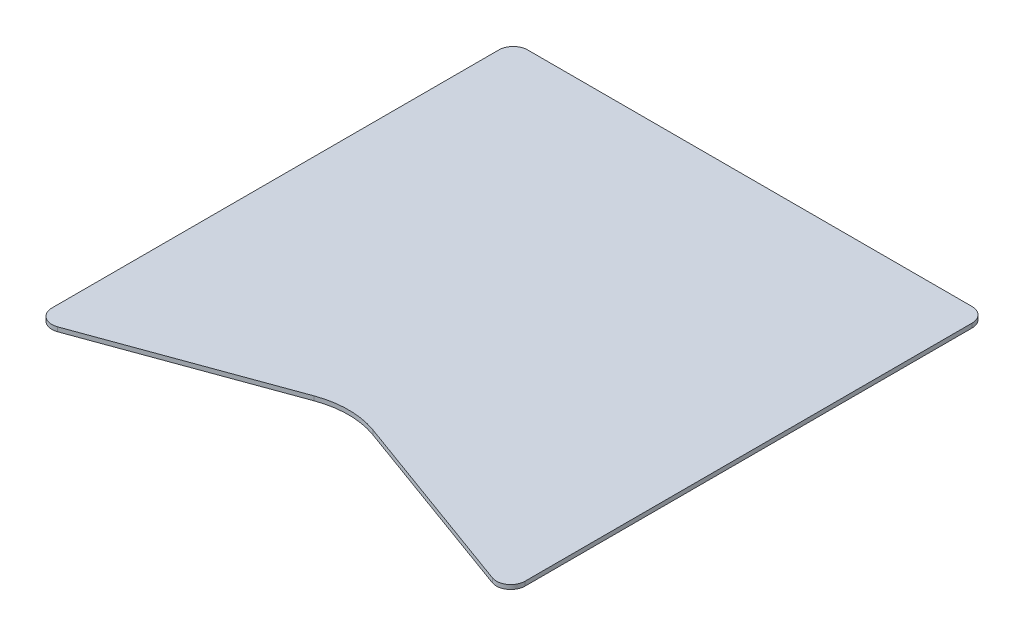
ISO-10303-21;
HEADER;
FILE_DESCRIPTION(('STEP AP214'),'2;1');
FILE_NAME('part.step','',(''),(''),'','','');
FILE_SCHEMA(('AUTOMOTIVE_DESIGN { 1 0 10303 214 1 1 1 1 }'));
ENDSEC;
DATA;
#1=APPLICATION_CONTEXT('core data for automotive mechanical design processes');
#2=APPLICATION_PROTOCOL_DEFINITION('international standard','automotive_design',2000,#1);
#3=PRODUCT_CONTEXT('',#1,'mechanical');
#4=PRODUCT('Part','Part','',(#3));
#5=PRODUCT_RELATED_PRODUCT_CATEGORY('part','',(#4));
#6=PRODUCT_DEFINITION_FORMATION('','',#4);
#7=PRODUCT_DEFINITION_CONTEXT('part definition',#1,'design');
#8=PRODUCT_DEFINITION('design','',#6,#7);
#9=PRODUCT_DEFINITION_SHAPE('','',#8);
#10=(LENGTH_UNIT() NAMED_UNIT(*) SI_UNIT(.MILLI.,.METRE.));
#11=(NAMED_UNIT(*) PLANE_ANGLE_UNIT() SI_UNIT($,.RADIAN.));
#12=(NAMED_UNIT(*) SI_UNIT($,.STERADIAN.) SOLID_ANGLE_UNIT());
#13=UNCERTAINTY_MEASURE_WITH_UNIT(LENGTH_MEASURE(1.E-05),#10,'distance_accuracy_value','');
#14=(GEOMETRIC_REPRESENTATION_CONTEXT(3) GLOBAL_UNCERTAINTY_ASSIGNED_CONTEXT((#13)) GLOBAL_UNIT_ASSIGNED_CONTEXT((#10,
#11,#12)) REPRESENTATION_CONTEXT('',''));
#15=CARTESIAN_POINT('',(0.,0.,0.));
#16=DIRECTION('',(0.,0.,1.));
#17=DIRECTION('',(1.,0.,0.));
#18=AXIS2_PLACEMENT_3D('',#15,#16,#17);
#19=CARTESIAN_POINT('',(24.4316355925699,3.,67.1253671109287));
#20=DIRECTION('',(-0.342020143325673,0.,-0.939692620785907));
#21=DIRECTION('',(-0.939692620785907,0.,0.342020143325673));
#22=AXIS2_PLACEMENT_3D('',#19,#20,#21);
#23=PLANE('',#22);
#24=DIRECTION('',(0.939692620785907,0.,-0.342020143325673));
#25=VECTOR('',#24,1.);
#26=CARTESIAN_POINT('',(24.4316355925699,3.,67.1253671109287));
#27=LINE('',#26,#25);
#28=CARTESIAN_POINT('',(13.4202014332567,3.,71.1332013815009));
#29=VERTEX_POINT('',#28);
#30=CARTESIAN_POINT('',(144.47879140046,3.,23.4317756885392));
#31=VERTEX_POINT('',#30);
#32=EDGE_CURVE('E162',#29,#31,#27,.T.);
#33=ORIENTED_EDGE('',*,*,#32,.F.);
#34=DIRECTION('',(0.,-1.,0.));
#35=VECTOR('',#34,1.);
#36=CARTESIAN_POINT('',(13.4202014332567,0.,71.1332013815009));
#37=LINE('',#36,#35);
#38=CARTESIAN_POINT('',(13.4202014332567,0.,71.1332013815009));
#39=VERTEX_POINT('',#38);
#40=EDGE_CURVE('E12',#29,#39,#37,.T.);
#41=ORIENTED_EDGE('',*,*,#40,.T.);
#42=DIRECTION('',(0.939692620785907,0.,-0.342020143325673));
#43=VECTOR('',#42,1.);
#44=CARTESIAN_POINT('',(24.4316355925699,0.,67.1253671109287));
#45=LINE('',#44,#43);
#46=CARTESIAN_POINT('',(144.47879140046,0.,23.4317756885392));
#47=VERTEX_POINT('',#46);
#48=EDGE_CURVE('E179',#39,#47,#45,.T.);
#49=ORIENTED_EDGE('',*,*,#48,.T.);
#50=DIRECTION('',(0.,-1.,0.));
#51=VECTOR('',#50,1.);
#52=CARTESIAN_POINT('',(144.47879140046,3.,23.4317756885392));
#53=LINE('',#52,#51);
#54=EDGE_CURVE('E177',#31,#47,#53,.T.);
#55=ORIENTED_EDGE('',*,*,#54,.F.);
#56=EDGE_LOOP('',(#33,#41,#49,#55));
#57=FACE_BOUND('',#56,.T.);
#58=ADVANCED_FACE('F82',(#57),#23,.F.);
#59=CARTESIAN_POINT('',(165.,3.,79.8133329356935));
#60=DIRECTION('',(0.,-1.,0.));
#61=DIRECTION('',(0.,0.,-1.));
#62=AXIS2_PLACEMENT_3D('',#59,#60,#61);
#63=CYLINDRICAL_SURFACE('',#62,60.);
#64=CARTESIAN_POINT('',(165.,0.,79.8133329356935));
#65=DIRECTION('',(0.,1.,0.));
#66=DIRECTION('',(0.,0.,1.));
#67=AXIS2_PLACEMENT_3D('',#64,#65,#66);
#68=CIRCLE('',#67,60.);
#69=CARTESIAN_POINT('',(185.52120859954,0.,23.4317756885392));
#70=VERTEX_POINT('',#69);
#71=EDGE_CURVE('E205',#70,#47,#68,.T.);
#72=ORIENTED_EDGE('',*,*,#71,.F.);
#73=DIRECTION('',(0.,-1.,0.));
#74=VECTOR('',#73,1.);
#75=CARTESIAN_POINT('',(185.52120859954,3.,23.4317756885392));
#76=LINE('',#75,#74);
#77=CARTESIAN_POINT('',(185.52120859954,3.,23.4317756885392));
#78=VERTEX_POINT('',#77);
#79=EDGE_CURVE('E185',#78,#70,#76,.T.);
#80=ORIENTED_EDGE('',*,*,#79,.F.);
#81=CARTESIAN_POINT('',(165.,3.,79.8133329356935));
#82=DIRECTION('',(0.,1.,0.));
#83=DIRECTION('',(0.,0.,1.));
#84=AXIS2_PLACEMENT_3D('',#81,#82,#83);
#85=CIRCLE('',#84,60.);
#86=EDGE_CURVE('E168',#78,#31,#85,.T.);
#87=ORIENTED_EDGE('',*,*,#86,.T.);
#88=ORIENTED_EDGE('',*,*,#54,.T.);
#89=EDGE_LOOP('',(#72,#80,#87,#88));
#90=FACE_BOUND('',#89,.T.);
#91=ADVANCED_FACE('F187',(#90),#63,.F.);
#92=CARTESIAN_POINT('',(14.1710312927996,3.,-38.9345884873514));
#93=DIRECTION('',(0.342020143325673,0.,-0.939692620785907));
#94=DIRECTION('',(-0.939692620785907,0.,-0.342020143325673));
#95=AXIS2_PLACEMENT_3D('',#92,#93,#94);
#96=PLANE('',#95);
#97=DIRECTION('',(0.939692620785907,0.,0.342020143325673));
#98=VECTOR('',#97,1.);
#99=CARTESIAN_POINT('',(14.1710312927996,0.,-38.9345884873514));
#100=LINE('',#99,#98);
#101=CARTESIAN_POINT('',(316.579798566744,0.,71.1332013815009));
#102=VERTEX_POINT('',#101);
#103=EDGE_CURVE('E209',#70,#102,#100,.T.);
#104=ORIENTED_EDGE('',*,*,#103,.T.);
#105=DIRECTION('',(0.,1.,0.));
#106=VECTOR('',#105,1.);
#107=CARTESIAN_POINT('',(316.579798566744,3.,71.1332013815009));
#108=LINE('',#107,#106);
#109=CARTESIAN_POINT('',(316.579798566744,3.,71.1332013815009));
#110=VERTEX_POINT('',#109);
#111=EDGE_CURVE('E91',#102,#110,#108,.T.);
#112=ORIENTED_EDGE('',*,*,#111,.T.);
#113=DIRECTION('',(0.939692620785907,0.,0.342020143325673));
#114=VECTOR('',#113,1.);
#115=CARTESIAN_POINT('',(14.1710312927996,3.,-38.9345884873514));
#116=LINE('',#115,#114);
#117=EDGE_CURVE('E190',#78,#110,#116,.T.);
#118=ORIENTED_EDGE('',*,*,#117,.F.);
#119=ORIENTED_EDGE('',*,*,#79,.T.);
#120=EDGE_LOOP('',(#104,#112,#118,#119));
#121=FACE_BOUND('',#120,.T.);
#122=ADVANCED_FACE('F264',(#121),#96,.F.);
#123=CARTESIAN_POINT('',(330.,3.,-1.11022302462516E-13));
#124=DIRECTION('',(-1.,0.,0.));
#125=DIRECTION('',(0.,0.,1.));
#126=AXIS2_PLACEMENT_3D('',#123,#124,#125);
#127=PLANE('',#126);
#128=DIRECTION('',(0.,0.,-1.));
#129=VECTOR('',#128,1.);
#130=CARTESIAN_POINT('',(330.,0.,-1.11022302462516E-13));
#131=LINE('',#130,#129);
#132=CARTESIAN_POINT('',(330.,0.,61.7362751736418));
#133=VERTEX_POINT('',#132);
#134=CARTESIAN_POINT('',(330.,0.,-250.));
#135=VERTEX_POINT('',#134);
#136=EDGE_CURVE('E212',#133,#135,#131,.T.);
#137=ORIENTED_EDGE('',*,*,#136,.T.);
#138=DIRECTION('',(0.,1.,0.));
#139=VECTOR('',#138,1.);
#140=CARTESIAN_POINT('',(330.,3.,-250.));
#141=LINE('',#140,#139);
#142=CARTESIAN_POINT('',(330.,3.,-250.));
#143=VERTEX_POINT('',#142);
#144=EDGE_CURVE('E223',#135,#143,#141,.T.);
#145=ORIENTED_EDGE('',*,*,#144,.T.);
#146=DIRECTION('',(0.,0.,-1.));
#147=VECTOR('',#146,1.);
#148=CARTESIAN_POINT('',(330.,3.,-1.11022302462516E-13));
#149=LINE('',#148,#147);
#150=CARTESIAN_POINT('',(330.,3.,61.7362751736418));
#151=VERTEX_POINT('',#150);
#152=EDGE_CURVE('E193',#151,#143,#149,.T.);
#153=ORIENTED_EDGE('',*,*,#152,.F.);
#154=DIRECTION('',(0.,1.,0.));
#155=VECTOR('',#154,1.);
#156=CARTESIAN_POINT('',(330.,3.,61.7362751736418));
#157=LINE('',#156,#155);
#158=EDGE_CURVE('E184',#151,#133,#157,.F.);
#159=ORIENTED_EDGE('',*,*,#158,.T.);
#160=EDGE_LOOP('',(#137,#145,#153,#159));
#161=FACE_BOUND('',#160,.T.);
#162=ADVANCED_FACE('F269',(#161),#127,.F.);
#163=CARTESIAN_POINT('',(0.,3.,0.));
#164=DIRECTION('',(-1.,0.,0.));
#165=DIRECTION('',(0.,0.,1.));
#166=AXIS2_PLACEMENT_3D('',#163,#164,#165);
#167=PLANE('',#166);
#168=DIRECTION('',(0.,0.,-1.));
#169=VECTOR('',#168,1.);
#170=CARTESIAN_POINT('',(0.,3.,0.));
#171=LINE('',#170,#169);
#172=CARTESIAN_POINT('',(0.,3.,61.7362751736418));
#173=VERTEX_POINT('',#172);
#174=CARTESIAN_POINT('',(0.,3.,-250.));
#175=VERTEX_POINT('',#174);
#176=EDGE_CURVE('E199',#173,#175,#171,.T.);
#177=ORIENTED_EDGE('',*,*,#176,.T.);
#178=DIRECTION('',(0.,1.,0.));
#179=VECTOR('',#178,1.);
#180=CARTESIAN_POINT('',(0.,0.,-250.));
#181=LINE('',#180,#179);
#182=CARTESIAN_POINT('',(0.,0.,-250.));
#183=VERTEX_POINT('',#182);
#184=EDGE_CURVE('E258',#175,#183,#181,.F.);
#185=ORIENTED_EDGE('',*,*,#184,.T.);
#186=DIRECTION('',(0.,0.,-1.));
#187=VECTOR('',#186,1.);
#188=CARTESIAN_POINT('',(0.,0.,0.));
#189=LINE('',#188,#187);
#190=CARTESIAN_POINT('',(0.,0.,61.7362751736418));
#191=VERTEX_POINT('',#190);
#192=EDGE_CURVE('E174',#191,#183,#189,.T.);
#193=ORIENTED_EDGE('',*,*,#192,.F.);
#194=DIRECTION('',(0.,-1.,0.));
#195=VECTOR('',#194,1.);
#196=CARTESIAN_POINT('',(0.,3.,61.7362751736418));
#197=LINE('',#196,#195);
#198=EDGE_CURVE('E255',#191,#173,#197,.F.);
#199=ORIENTED_EDGE('',*,*,#198,.T.);
#200=EDGE_LOOP('',(#177,#185,#193,#199));
#201=FACE_BOUND('',#200,.T.);
#202=ADVANCED_FACE('F312',(#201),#167,.T.);
#203=CARTESIAN_POINT('',(0.,0.,0.));
#204=DIRECTION('',(0.,1.,0.));
#205=DIRECTION('',(0.,0.,1.));
#206=AXIS2_PLACEMENT_3D('',#203,#204,#205);
#207=PLANE('',#206);
#208=DIRECTION('',(1.,0.,0.));
#209=VECTOR('',#208,1.);
#210=CARTESIAN_POINT('',(0.,0.,-260.));
#211=LINE('',#210,#209);
#212=CARTESIAN_POINT('',(9.99999999999996,0.,-260.));
#213=VERTEX_POINT('',#212);
#214=CARTESIAN_POINT('',(320.,0.,-260.));
#215=VERTEX_POINT('',#214);
#216=EDGE_CURVE('E206',#213,#215,#211,.T.);
#217=ORIENTED_EDGE('',*,*,#216,.T.);
#218=CARTESIAN_POINT('',(320.,0.,-250.));
#219=DIRECTION('',(0.,1.,0.));
#220=DIRECTION('',(0.,0.,1.));
#221=AXIS2_PLACEMENT_3D('',#218,#219,#220);
#222=CIRCLE('',#221,10.);
#223=EDGE_CURVE('E252',#215,#135,#222,.F.);
#224=ORIENTED_EDGE('',*,*,#223,.T.);
#225=ORIENTED_EDGE('',*,*,#136,.F.);
#226=CARTESIAN_POINT('',(320.,0.,61.7362751736418));
#227=DIRECTION('',(0.,1.,0.));
#228=DIRECTION('',(0.,0.,1.));
#229=AXIS2_PLACEMENT_3D('',#226,#227,#228);
#230=CIRCLE('',#229,10.);
#231=EDGE_CURVE('E105',#133,#102,#230,.F.);
#232=ORIENTED_EDGE('',*,*,#231,.T.);
#233=ORIENTED_EDGE('',*,*,#103,.F.);
#234=ORIENTED_EDGE('',*,*,#71,.T.);
#235=ORIENTED_EDGE('',*,*,#48,.F.);
#236=CARTESIAN_POINT('',(10.,0.,61.7362751736418));
#237=DIRECTION('',(0.,1.,0.));
#238=DIRECTION('',(0.,0.,1.));
#239=AXIS2_PLACEMENT_3D('',#236,#237,#238);
#240=CIRCLE('',#239,10.);
#241=EDGE_CURVE('E98',#39,#191,#240,.F.);
#242=ORIENTED_EDGE('',*,*,#241,.T.);
#243=ORIENTED_EDGE('',*,*,#192,.T.);
#244=CARTESIAN_POINT('',(9.99999999999996,0.,-250.));
#245=DIRECTION('',(0.,1.,0.));
#246=DIRECTION('',(0.,0.,1.));
#247=AXIS2_PLACEMENT_3D('',#244,#245,#246);
#248=CIRCLE('',#247,10.);
#249=EDGE_CURVE('E249',#183,#213,#248,.F.);
#250=ORIENTED_EDGE('',*,*,#249,.T.);
#251=EDGE_LOOP('',(#217,#224,#225,#232,#233,#234,#235,#242,#243,#250));
#252=FACE_BOUND('',#251,.T.);
#253=ADVANCED_FACE('F300',(#252),#207,.F.);
#254=CARTESIAN_POINT('',(0.,3.,0.));
#255=DIRECTION('',(0.,1.,0.));
#256=DIRECTION('',(0.,0.,1.));
#257=AXIS2_PLACEMENT_3D('',#254,#255,#256);
#258=PLANE('',#257);
#259=ORIENTED_EDGE('',*,*,#152,.T.);
#260=CARTESIAN_POINT('',(320.,3.,-250.));
#261=DIRECTION('',(0.,1.,0.));
#262=DIRECTION('',(0.,0.,1.));
#263=AXIS2_PLACEMENT_3D('',#260,#261,#262);
#264=CIRCLE('',#263,10.);
#265=CARTESIAN_POINT('',(320.,3.,-260.));
#266=VERTEX_POINT('',#265);
#267=EDGE_CURVE('E235',#143,#266,#264,.T.);
#268=ORIENTED_EDGE('',*,*,#267,.T.);
#269=DIRECTION('',(1.,0.,0.));
#270=VECTOR('',#269,1.);
#271=CARTESIAN_POINT('',(0.,3.,-260.));
#272=LINE('',#271,#270);
#273=CARTESIAN_POINT('',(9.99999999999996,3.,-260.));
#274=VERTEX_POINT('',#273);
#275=EDGE_CURVE('E305',#274,#266,#272,.T.);
#276=ORIENTED_EDGE('',*,*,#275,.F.);
#277=CARTESIAN_POINT('',(9.99999999999996,3.,-250.));
#278=DIRECTION('',(0.,1.,0.));
#279=DIRECTION('',(0.,0.,1.));
#280=AXIS2_PLACEMENT_3D('',#277,#278,#279);
#281=CIRCLE('',#280,10.);
#282=EDGE_CURVE('E232',#274,#175,#281,.T.);
#283=ORIENTED_EDGE('',*,*,#282,.T.);
#284=ORIENTED_EDGE('',*,*,#176,.F.);
#285=CARTESIAN_POINT('',(10.,3.,61.7362751736418));
#286=DIRECTION('',(0.,1.,0.));
#287=DIRECTION('',(0.,0.,1.));
#288=AXIS2_PLACEMENT_3D('',#285,#286,#287);
#289=CIRCLE('',#288,10.);
#290=EDGE_CURVE('E171',#173,#29,#289,.T.);
#291=ORIENTED_EDGE('',*,*,#290,.T.);
#292=ORIENTED_EDGE('',*,*,#32,.T.);
#293=ORIENTED_EDGE('',*,*,#86,.F.);
#294=ORIENTED_EDGE('',*,*,#117,.T.);
#295=CARTESIAN_POINT('',(320.,3.,61.7362751736418));
#296=DIRECTION('',(0.,1.,0.));
#297=DIRECTION('',(0.,0.,1.));
#298=AXIS2_PLACEMENT_3D('',#295,#296,#297);
#299=CIRCLE('',#298,10.);
#300=EDGE_CURVE('E229',#110,#151,#299,.T.);
#301=ORIENTED_EDGE('',*,*,#300,.T.);
#302=EDGE_LOOP('',(#259,#268,#276,#283,#284,#291,#292,#293,#294,#301));
#303=FACE_BOUND('',#302,.T.);
#304=ADVANCED_FACE('F165',(#303),#258,.T.);
#305=CARTESIAN_POINT('',(0.,0.,-260.));
#306=DIRECTION('',(0.,0.,1.));
#307=DIRECTION('',(1.,0.,0.));
#308=AXIS2_PLACEMENT_3D('',#305,#306,#307);
#309=PLANE('',#308);
#310=ORIENTED_EDGE('',*,*,#275,.T.);
#311=DIRECTION('',(0.,1.,0.));
#312=VECTOR('',#311,1.);
#313=CARTESIAN_POINT('',(320.,0.,-260.));
#314=LINE('',#313,#312);
#315=EDGE_CURVE('E242',#266,#215,#314,.F.);
#316=ORIENTED_EDGE('',*,*,#315,.T.);
#317=ORIENTED_EDGE('',*,*,#216,.F.);
#318=DIRECTION('',(0.,1.,0.));
#319=VECTOR('',#318,1.);
#320=CARTESIAN_POINT('',(9.99999999999996,3.,-260.));
#321=LINE('',#320,#319);
#322=EDGE_CURVE('E238',#213,#274,#321,.T.);
#323=ORIENTED_EDGE('',*,*,#322,.T.);
#324=EDGE_LOOP('',(#310,#316,#317,#323));
#325=FACE_BOUND('',#324,.T.);
#326=ADVANCED_FACE('F290',(#325),#309,.F.);
#327=CARTESIAN_POINT('',(320.,3.,-250.));
#328=DIRECTION('',(0.,1.,0.));
#329=DIRECTION('',(0.,0.,1.));
#330=AXIS2_PLACEMENT_3D('',#327,#328,#329);
#331=CYLINDRICAL_SURFACE('',#330,10.);
#332=ORIENTED_EDGE('',*,*,#223,.F.);
#333=ORIENTED_EDGE('',*,*,#315,.F.);
#334=ORIENTED_EDGE('',*,*,#267,.F.);
#335=ORIENTED_EDGE('',*,*,#144,.F.);
#336=EDGE_LOOP('',(#332,#333,#334,#335));
#337=FACE_BOUND('',#336,.T.);
#338=ADVANCED_FACE('F278',(#337),#331,.T.);
#339=CARTESIAN_POINT('',(9.99999999999996,0.,-250.));
#340=DIRECTION('',(0.,-1.,0.));
#341=DIRECTION('',(0.,0.,-1.));
#342=AXIS2_PLACEMENT_3D('',#339,#340,#341);
#343=CYLINDRICAL_SURFACE('',#342,10.);
#344=ORIENTED_EDGE('',*,*,#249,.F.);
#345=ORIENTED_EDGE('',*,*,#184,.F.);
#346=ORIENTED_EDGE('',*,*,#282,.F.);
#347=ORIENTED_EDGE('',*,*,#322,.F.);
#348=EDGE_LOOP('',(#344,#345,#346,#347));
#349=FACE_BOUND('',#348,.T.);
#350=ADVANCED_FACE('F273',(#349),#343,.T.);
#351=CARTESIAN_POINT('',(320.,3.,61.7362751736418));
#352=DIRECTION('',(0.,1.,0.));
#353=DIRECTION('',(0.,0.,1.));
#354=AXIS2_PLACEMENT_3D('',#351,#352,#353);
#355=CYLINDRICAL_SURFACE('',#354,10.);
#356=ORIENTED_EDGE('',*,*,#231,.F.);
#357=ORIENTED_EDGE('',*,*,#158,.F.);
#358=ORIENTED_EDGE('',*,*,#300,.F.);
#359=ORIENTED_EDGE('',*,*,#111,.F.);
#360=EDGE_LOOP('',(#356,#357,#358,#359));
#361=FACE_BOUND('',#360,.T.);
#362=ADVANCED_FACE('F271',(#361),#355,.T.);
#363=CARTESIAN_POINT('',(10.,3.,61.7362751736418));
#364=DIRECTION('',(0.,1.,0.));
#365=DIRECTION('',(0.,0.,1.));
#366=AXIS2_PLACEMENT_3D('',#363,#364,#365);
#367=CYLINDRICAL_SURFACE('',#366,10.);
#368=ORIENTED_EDGE('',*,*,#290,.F.);
#369=ORIENTED_EDGE('',*,*,#198,.F.);
#370=ORIENTED_EDGE('',*,*,#241,.F.);
#371=ORIENTED_EDGE('',*,*,#40,.F.);
#372=EDGE_LOOP('',(#368,#369,#370,#371));
#373=FACE_BOUND('',#372,.T.);
#374=ADVANCED_FACE('F84',(#373),#367,.T.);
#375=CLOSED_SHELL('',(#58,#91,#122,#162,#202,#253,#304,#326,#338,#350,#362,#374));
#376=MANIFOLD_SOLID_BREP('B2',#375);
#377=ADVANCED_BREP_SHAPE_REPRESENTATION('',(#18,#376),#14);
#378=SHAPE_DEFINITION_REPRESENTATION(#9,#377);
ENDSEC;
END-ISO-10303-21;
